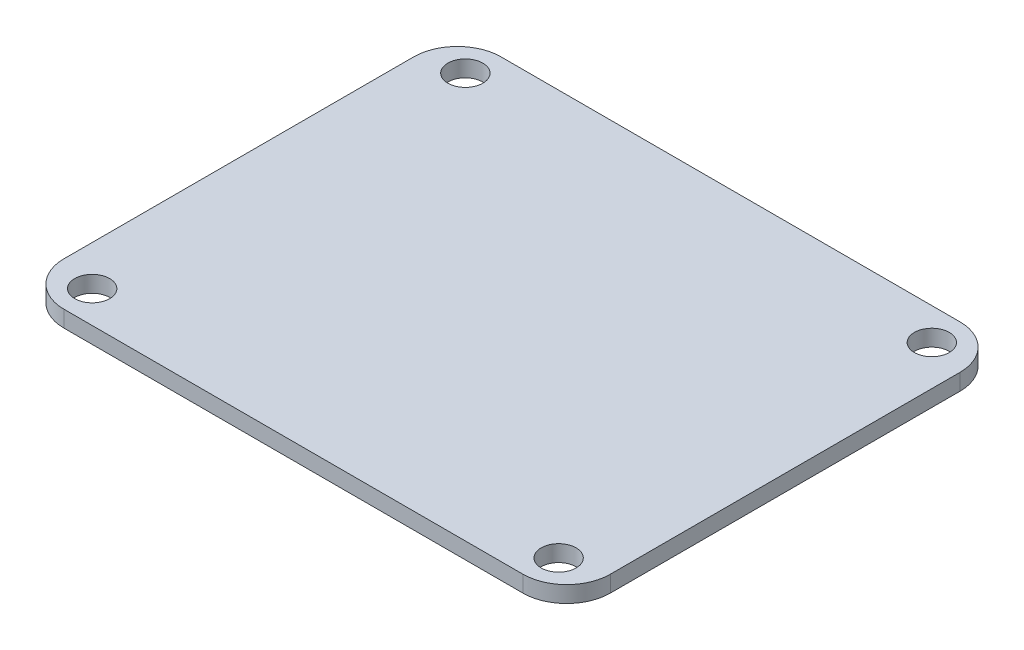
ISO-10303-21;
HEADER;
FILE_DESCRIPTION(('STEP AP214'),'2;1');
FILE_NAME('part.step','',(''),(''),'','','');
FILE_SCHEMA(('AUTOMOTIVE_DESIGN { 1 0 10303 214 1 1 1 1 }'));
ENDSEC;
DATA;
#1=APPLICATION_CONTEXT('core data for automotive mechanical design processes');
#2=APPLICATION_PROTOCOL_DEFINITION('international standard','automotive_design',2000,#1);
#3=PRODUCT_CONTEXT('',#1,'mechanical');
#4=PRODUCT('Part','Part','',(#3));
#5=PRODUCT_RELATED_PRODUCT_CATEGORY('part','',(#4));
#6=PRODUCT_DEFINITION_FORMATION('','',#4);
#7=PRODUCT_DEFINITION_CONTEXT('part definition',#1,'design');
#8=PRODUCT_DEFINITION('design','',#6,#7);
#9=PRODUCT_DEFINITION_SHAPE('','',#8);
#10=(LENGTH_UNIT() NAMED_UNIT(*) SI_UNIT(.MILLI.,.METRE.));
#11=(NAMED_UNIT(*) PLANE_ANGLE_UNIT() SI_UNIT($,.RADIAN.));
#12=(NAMED_UNIT(*) SI_UNIT($,.STERADIAN.) SOLID_ANGLE_UNIT());
#13=UNCERTAINTY_MEASURE_WITH_UNIT(LENGTH_MEASURE(1.E-05),#10,'distance_accuracy_value','');
#14=(GEOMETRIC_REPRESENTATION_CONTEXT(3) GLOBAL_UNCERTAINTY_ASSIGNED_CONTEXT((#13)) GLOBAL_UNIT_ASSIGNED_CONTEXT((#10,
#11,#12)) REPRESENTATION_CONTEXT('',''));
#15=CARTESIAN_POINT('',(0.,0.,0.));
#16=DIRECTION('',(0.,0.,1.));
#17=DIRECTION('',(1.,0.,0.));
#18=AXIS2_PLACEMENT_3D('',#15,#16,#17);
#19=CARTESIAN_POINT('',(-16.,1.5,16.));
#20=DIRECTION('',(0.,1.,0.));
#21=DIRECTION('',(0.,0.,1.));
#22=AXIS2_PLACEMENT_3D('',#19,#20,#21);
#23=PLANE('',#22);
#24=CARTESIAN_POINT('',(26.3437965591447,1.5,-17.0750372473158));
#25=DIRECTION('',(0.,1.,0.));
#26=DIRECTION('',(0.,0.,-1.));
#27=AXIS2_PLACEMENT_3D('',#24,#25,#26);
#28=CIRCLE('',#27,1.59760699781686);
#29=CARTESIAN_POINT('',(26.3437965591447,1.5,-18.6726442451327));
#30=VERTEX_POINT('',#29);
#31=EDGE_CURVE('E190',#30,#30,#28,.T.);
#32=ORIENTED_EDGE('',*,*,#31,.F.);
#33=EDGE_LOOP('',(#32));
#34=FACE_BOUND('',#33,.T.);
#35=CARTESIAN_POINT('',(-16.3437965591447,1.5,-17.0750372473158));
#36=DIRECTION('',(0.,1.,0.));
#37=DIRECTION('',(0.,0.,1.));
#38=AXIS2_PLACEMENT_3D('',#35,#36,#37);
#39=CIRCLE('',#38,1.59760699781686);
#40=CARTESIAN_POINT('',(-16.3437965591447,1.5,-15.4774302494989));
#41=VERTEX_POINT('',#40);
#42=EDGE_CURVE('E136',#41,#41,#39,.T.);
#43=ORIENTED_EDGE('',*,*,#42,.F.);
#44=EDGE_LOOP('',(#43));
#45=FACE_BOUND('',#44,.T.);
#46=CARTESIAN_POINT('',(-16.,1.5,16.));
#47=DIRECTION('',(0.,1.,0.));
#48=DIRECTION('',(0.,0.,1.));
#49=AXIS2_PLACEMENT_3D('',#46,#47,#48);
#50=CIRCLE('',#49,4.);
#51=CARTESIAN_POINT('',(-20.,1.5,16.));
#52=VERTEX_POINT('',#51);
#53=CARTESIAN_POINT('',(-16.,1.5,20.));
#54=VERTEX_POINT('',#53);
#55=EDGE_CURVE('E147',#52,#54,#50,.T.);
#56=ORIENTED_EDGE('',*,*,#55,.T.);
#57=DIRECTION('',(1.,0.,0.));
#58=VECTOR('',#57,1.);
#59=CARTESIAN_POINT('',(-16.,1.5,20.));
#60=LINE('',#59,#58);
#61=CARTESIAN_POINT('',(26.,1.5,20.));
#62=VERTEX_POINT('',#61);
#63=EDGE_CURVE('E95',#54,#62,#60,.T.);
#64=ORIENTED_EDGE('',*,*,#63,.T.);
#65=CARTESIAN_POINT('',(26.,1.5,16.));
#66=DIRECTION('',(0.,1.,0.));
#67=DIRECTION('',(0.,0.,1.));
#68=AXIS2_PLACEMENT_3D('',#65,#66,#67);
#69=CIRCLE('',#68,4.);
#70=CARTESIAN_POINT('',(30.,1.5,16.));
#71=VERTEX_POINT('',#70);
#72=EDGE_CURVE('E162',#62,#71,#69,.T.);
#73=ORIENTED_EDGE('',*,*,#72,.T.);
#74=DIRECTION('',(0.,0.,-1.));
#75=VECTOR('',#74,1.);
#76=CARTESIAN_POINT('',(30.,1.5,16.));
#77=LINE('',#76,#75);
#78=CARTESIAN_POINT('',(30.,1.5,-16.));
#79=VERTEX_POINT('',#78);
#80=EDGE_CURVE('E175',#71,#79,#77,.T.);
#81=ORIENTED_EDGE('',*,*,#80,.T.);
#82=CARTESIAN_POINT('',(26.,1.5,-16.));
#83=DIRECTION('',(0.,1.,0.));
#84=DIRECTION('',(0.,0.,1.));
#85=AXIS2_PLACEMENT_3D('',#82,#83,#84);
#86=CIRCLE('',#85,4.);
#87=CARTESIAN_POINT('',(26.,1.5,-20.));
#88=VERTEX_POINT('',#87);
#89=EDGE_CURVE('E114',#79,#88,#86,.T.);
#90=ORIENTED_EDGE('',*,*,#89,.T.);
#91=DIRECTION('',(-1.,0.,0.));
#92=VECTOR('',#91,1.);
#93=CARTESIAN_POINT('',(-16.,1.5,-20.));
#94=LINE('',#93,#92);
#95=CARTESIAN_POINT('',(-16.,1.5,-20.));
#96=VERTEX_POINT('',#95);
#97=EDGE_CURVE('E108',#88,#96,#94,.T.);
#98=ORIENTED_EDGE('',*,*,#97,.T.);
#99=CARTESIAN_POINT('',(-16.,1.5,-16.));
#100=DIRECTION('',(0.,1.,0.));
#101=DIRECTION('',(0.,0.,1.));
#102=AXIS2_PLACEMENT_3D('',#99,#100,#101);
#103=CIRCLE('',#102,4.);
#104=CARTESIAN_POINT('',(-20.,1.5,-16.));
#105=VERTEX_POINT('',#104);
#106=EDGE_CURVE('E112',#96,#105,#103,.T.);
#107=ORIENTED_EDGE('',*,*,#106,.T.);
#108=DIRECTION('',(0.,0.,1.));
#109=VECTOR('',#108,1.);
#110=CARTESIAN_POINT('',(-20.,1.5,16.));
#111=LINE('',#110,#109);
#112=EDGE_CURVE('E52',#105,#52,#111,.T.);
#113=ORIENTED_EDGE('',*,*,#112,.T.);
#114=EDGE_LOOP('',(#56,#64,#73,#81,#90,#98,#107,#113));
#115=FACE_BOUND('',#114,.T.);
#116=CARTESIAN_POINT('',(26.3437965591447,1.5,17.0750372473158));
#117=DIRECTION('',(0.,1.,0.));
#118=DIRECTION('',(0.,0.,1.));
#119=AXIS2_PLACEMENT_3D('',#116,#117,#118);
#120=CIRCLE('',#119,1.59760699781686);
#121=CARTESIAN_POINT('',(26.3437965591447,1.5,18.6726442451326));
#122=VERTEX_POINT('',#121);
#123=EDGE_CURVE('E184',#122,#122,#120,.T.);
#124=ORIENTED_EDGE('',*,*,#123,.F.);
#125=EDGE_LOOP('',(#124));
#126=FACE_BOUND('',#125,.T.);
#127=CARTESIAN_POINT('',(-16.3437965591447,1.5,17.0750372473158));
#128=DIRECTION('',(0.,1.,0.));
#129=DIRECTION('',(0.,0.,-1.));
#130=AXIS2_PLACEMENT_3D('',#127,#128,#129);
#131=CIRCLE('',#130,1.59760699781686);
#132=CARTESIAN_POINT('',(-16.3437965591447,1.5,15.4774302494989));
#133=VERTEX_POINT('',#132);
#134=EDGE_CURVE('E196',#133,#133,#131,.T.);
#135=ORIENTED_EDGE('',*,*,#134,.F.);
#136=EDGE_LOOP('',(#135));
#137=FACE_BOUND('',#136,.T.);
#138=ADVANCED_FACE('F35',(#34,#45,#115,#126,#137),#23,.T.);
#139=CARTESIAN_POINT('',(-16.,0.,16.));
#140=DIRECTION('',(0.,1.,0.));
#141=DIRECTION('',(0.,0.,1.));
#142=AXIS2_PLACEMENT_3D('',#139,#140,#141);
#143=PLANE('',#142);
#144=CARTESIAN_POINT('',(26.3437965591447,0.,-17.0750372473158));
#145=DIRECTION('',(0.,1.,0.));
#146=DIRECTION('',(0.,0.,-1.));
#147=AXIS2_PLACEMENT_3D('',#144,#145,#146);
#148=CIRCLE('',#147,1.59760699781686);
#149=CARTESIAN_POINT('',(26.3437965591447,0.,-18.6726442451327));
#150=VERTEX_POINT('',#149);
#151=EDGE_CURVE('E193',#150,#150,#148,.T.);
#152=ORIENTED_EDGE('',*,*,#151,.T.);
#153=EDGE_LOOP('',(#152));
#154=FACE_BOUND('',#153,.T.);
#155=CARTESIAN_POINT('',(-16.3437965591447,0.,-17.0750372473158));
#156=DIRECTION('',(0.,1.,0.));
#157=DIRECTION('',(0.,0.,1.));
#158=AXIS2_PLACEMENT_3D('',#155,#156,#157);
#159=CIRCLE('',#158,1.59760699781686);
#160=CARTESIAN_POINT('',(-16.3437965591447,0.,-15.4774302494989));
#161=VERTEX_POINT('',#160);
#162=EDGE_CURVE('E181',#161,#161,#159,.T.);
#163=ORIENTED_EDGE('',*,*,#162,.T.);
#164=EDGE_LOOP('',(#163));
#165=FACE_BOUND('',#164,.T.);
#166=CARTESIAN_POINT('',(-16.,0.,16.));
#167=DIRECTION('',(0.,1.,0.));
#168=DIRECTION('',(0.,0.,1.));
#169=AXIS2_PLACEMENT_3D('',#166,#167,#168);
#170=CIRCLE('',#169,4.);
#171=CARTESIAN_POINT('',(-20.,0.,16.));
#172=VERTEX_POINT('',#171);
#173=CARTESIAN_POINT('',(-16.,0.,20.));
#174=VERTEX_POINT('',#173);
#175=EDGE_CURVE('E132',#172,#174,#170,.T.);
#176=ORIENTED_EDGE('',*,*,#175,.F.);
#177=DIRECTION('',(0.,0.,1.));
#178=VECTOR('',#177,1.);
#179=CARTESIAN_POINT('',(-20.,0.,16.));
#180=LINE('',#179,#178);
#181=CARTESIAN_POINT('',(-20.,0.,-16.));
#182=VERTEX_POINT('',#181);
#183=EDGE_CURVE('E87',#182,#172,#180,.T.);
#184=ORIENTED_EDGE('',*,*,#183,.F.);
#185=CARTESIAN_POINT('',(-16.,0.,-16.));
#186=DIRECTION('',(0.,1.,0.));
#187=DIRECTION('',(0.,0.,1.));
#188=AXIS2_PLACEMENT_3D('',#185,#186,#187);
#189=CIRCLE('',#188,4.);
#190=CARTESIAN_POINT('',(-16.,0.,-20.));
#191=VERTEX_POINT('',#190);
#192=EDGE_CURVE('E81',#191,#182,#189,.T.);
#193=ORIENTED_EDGE('',*,*,#192,.F.);
#194=DIRECTION('',(-1.,0.,0.));
#195=VECTOR('',#194,1.);
#196=CARTESIAN_POINT('',(-16.,0.,-20.));
#197=LINE('',#196,#195);
#198=CARTESIAN_POINT('',(26.,0.,-20.));
#199=VERTEX_POINT('',#198);
#200=EDGE_CURVE('E122',#199,#191,#197,.T.);
#201=ORIENTED_EDGE('',*,*,#200,.F.);
#202=CARTESIAN_POINT('',(26.,0.,-16.));
#203=DIRECTION('',(0.,1.,0.));
#204=DIRECTION('',(0.,0.,1.));
#205=AXIS2_PLACEMENT_3D('',#202,#203,#204);
#206=CIRCLE('',#205,4.);
#207=CARTESIAN_POINT('',(30.,0.,-16.));
#208=VERTEX_POINT('',#207);
#209=EDGE_CURVE('E142',#208,#199,#206,.T.);
#210=ORIENTED_EDGE('',*,*,#209,.F.);
#211=DIRECTION('',(0.,0.,-1.));
#212=VECTOR('',#211,1.);
#213=CARTESIAN_POINT('',(30.,0.,16.));
#214=LINE('',#213,#212);
#215=CARTESIAN_POINT('',(30.,0.,16.));
#216=VERTEX_POINT('',#215);
#217=EDGE_CURVE('E140',#216,#208,#214,.T.);
#218=ORIENTED_EDGE('',*,*,#217,.F.);
#219=CARTESIAN_POINT('',(26.,0.,16.));
#220=DIRECTION('',(0.,1.,0.));
#221=DIRECTION('',(0.,0.,1.));
#222=AXIS2_PLACEMENT_3D('',#219,#220,#221);
#223=CIRCLE('',#222,4.);
#224=CARTESIAN_POINT('',(26.,0.,20.));
#225=VERTEX_POINT('',#224);
#226=EDGE_CURVE('E138',#225,#216,#223,.T.);
#227=ORIENTED_EDGE('',*,*,#226,.F.);
#228=DIRECTION('',(1.,0.,0.));
#229=VECTOR('',#228,1.);
#230=CARTESIAN_POINT('',(-16.,0.,20.));
#231=LINE('',#230,#229);
#232=EDGE_CURVE('E135',#174,#225,#231,.T.);
#233=ORIENTED_EDGE('',*,*,#232,.F.);
#234=EDGE_LOOP('',(#176,#184,#193,#201,#210,#218,#227,#233));
#235=FACE_BOUND('',#234,.T.);
#236=CARTESIAN_POINT('',(26.3437965591447,0.,17.0750372473158));
#237=DIRECTION('',(0.,1.,0.));
#238=DIRECTION('',(0.,0.,1.));
#239=AXIS2_PLACEMENT_3D('',#236,#237,#238);
#240=CIRCLE('',#239,1.59760699781686);
#241=CARTESIAN_POINT('',(26.3437965591447,0.,18.6726442451326));
#242=VERTEX_POINT('',#241);
#243=EDGE_CURVE('E187',#242,#242,#240,.T.);
#244=ORIENTED_EDGE('',*,*,#243,.T.);
#245=EDGE_LOOP('',(#244));
#246=FACE_BOUND('',#245,.T.);
#247=CARTESIAN_POINT('',(-16.3437965591447,0.,17.0750372473158));
#248=DIRECTION('',(0.,1.,0.));
#249=DIRECTION('',(0.,0.,-1.));
#250=AXIS2_PLACEMENT_3D('',#247,#248,#249);
#251=CIRCLE('',#250,1.59760699781686);
#252=CARTESIAN_POINT('',(-16.3437965591447,0.,15.4774302494989));
#253=VERTEX_POINT('',#252);
#254=EDGE_CURVE('E199',#253,#253,#251,.T.);
#255=ORIENTED_EDGE('',*,*,#254,.T.);
#256=EDGE_LOOP('',(#255));
#257=FACE_BOUND('',#256,.T.);
#258=ADVANCED_FACE('F166',(#154,#165,#235,#246,#257),#143,.F.);
#259=CARTESIAN_POINT('',(-16.,1.5,16.));
#260=DIRECTION('',(0.,-1.,0.));
#261=DIRECTION('',(0.,0.,-1.));
#262=AXIS2_PLACEMENT_3D('',#259,#260,#261);
#263=CYLINDRICAL_SURFACE('',#262,4.);
#264=ORIENTED_EDGE('',*,*,#175,.T.);
#265=DIRECTION('',(0.,-1.,0.));
#266=VECTOR('',#265,1.);
#267=CARTESIAN_POINT('',(-16.,1.5,20.));
#268=LINE('',#267,#266);
#269=EDGE_CURVE('E11',#54,#174,#268,.T.);
#270=ORIENTED_EDGE('',*,*,#269,.F.);
#271=ORIENTED_EDGE('',*,*,#55,.F.);
#272=DIRECTION('',(0.,-1.,0.));
#273=VECTOR('',#272,1.);
#274=CARTESIAN_POINT('',(-20.,1.5,16.));
#275=LINE('',#274,#273);
#276=EDGE_CURVE('E128',#52,#172,#275,.T.);
#277=ORIENTED_EDGE('',*,*,#276,.T.);
#278=EDGE_LOOP('',(#264,#270,#271,#277));
#279=FACE_BOUND('',#278,.T.);
#280=ADVANCED_FACE('F37',(#279),#263,.T.);
#281=CARTESIAN_POINT('',(-16.,1.5,20.));
#282=DIRECTION('',(0.,0.,-1.));
#283=DIRECTION('',(-1.,0.,0.));
#284=AXIS2_PLACEMENT_3D('',#281,#282,#283);
#285=PLANE('',#284);
#286=ORIENTED_EDGE('',*,*,#232,.T.);
#287=DIRECTION('',(0.,-1.,0.));
#288=VECTOR('',#287,1.);
#289=CARTESIAN_POINT('',(26.,1.5,20.));
#290=LINE('',#289,#288);
#291=EDGE_CURVE('E44',#62,#225,#290,.T.);
#292=ORIENTED_EDGE('',*,*,#291,.F.);
#293=ORIENTED_EDGE('',*,*,#63,.F.);
#294=ORIENTED_EDGE('',*,*,#269,.T.);
#295=EDGE_LOOP('',(#286,#292,#293,#294));
#296=FACE_BOUND('',#295,.T.);
#297=ADVANCED_FACE('F234',(#296),#285,.F.);
#298=CARTESIAN_POINT('',(26.,1.5,16.));
#299=DIRECTION('',(0.,-1.,0.));
#300=DIRECTION('',(0.,0.,-1.));
#301=AXIS2_PLACEMENT_3D('',#298,#299,#300);
#302=CYLINDRICAL_SURFACE('',#301,4.);
#303=ORIENTED_EDGE('',*,*,#226,.T.);
#304=DIRECTION('',(0.,-1.,0.));
#305=VECTOR('',#304,1.);
#306=CARTESIAN_POINT('',(30.,1.5,16.));
#307=LINE('',#306,#305);
#308=EDGE_CURVE('E154',#71,#216,#307,.T.);
#309=ORIENTED_EDGE('',*,*,#308,.F.);
#310=ORIENTED_EDGE('',*,*,#72,.F.);
#311=ORIENTED_EDGE('',*,*,#291,.T.);
#312=EDGE_LOOP('',(#303,#309,#310,#311));
#313=FACE_BOUND('',#312,.T.);
#314=ADVANCED_FACE('F160',(#313),#302,.T.);
#315=CARTESIAN_POINT('',(30.,1.5,16.));
#316=DIRECTION('',(-1.,0.,0.));
#317=DIRECTION('',(0.,0.,1.));
#318=AXIS2_PLACEMENT_3D('',#315,#316,#317);
#319=PLANE('',#318);
#320=ORIENTED_EDGE('',*,*,#217,.T.);
#321=DIRECTION('',(0.,-1.,0.));
#322=VECTOR('',#321,1.);
#323=CARTESIAN_POINT('',(30.,1.5,-16.));
#324=LINE('',#323,#322);
#325=EDGE_CURVE('E151',#79,#208,#324,.T.);
#326=ORIENTED_EDGE('',*,*,#325,.F.);
#327=ORIENTED_EDGE('',*,*,#80,.F.);
#328=ORIENTED_EDGE('',*,*,#308,.T.);
#329=EDGE_LOOP('',(#320,#326,#327,#328));
#330=FACE_BOUND('',#329,.T.);
#331=ADVANCED_FACE('F171',(#330),#319,.F.);
#332=CARTESIAN_POINT('',(26.,1.5,-16.));
#333=DIRECTION('',(0.,-1.,0.));
#334=DIRECTION('',(0.,0.,-1.));
#335=AXIS2_PLACEMENT_3D('',#332,#333,#334);
#336=CYLINDRICAL_SURFACE('',#335,4.);
#337=ORIENTED_EDGE('',*,*,#209,.T.);
#338=DIRECTION('',(0.,-1.,0.));
#339=VECTOR('',#338,1.);
#340=CARTESIAN_POINT('',(26.,1.5,-20.));
#341=LINE('',#340,#339);
#342=EDGE_CURVE('E123',#88,#199,#341,.T.);
#343=ORIENTED_EDGE('',*,*,#342,.F.);
#344=ORIENTED_EDGE('',*,*,#89,.F.);
#345=ORIENTED_EDGE('',*,*,#325,.T.);
#346=EDGE_LOOP('',(#337,#343,#344,#345));
#347=FACE_BOUND('',#346,.T.);
#348=ADVANCED_FACE('F174',(#347),#336,.T.);
#349=CARTESIAN_POINT('',(-16.,1.5,-20.));
#350=DIRECTION('',(0.,0.,1.));
#351=DIRECTION('',(1.,0.,0.));
#352=AXIS2_PLACEMENT_3D('',#349,#350,#351);
#353=PLANE('',#352);
#354=ORIENTED_EDGE('',*,*,#200,.T.);
#355=DIRECTION('',(0.,-1.,0.));
#356=VECTOR('',#355,1.);
#357=CARTESIAN_POINT('',(-16.,1.5,-20.));
#358=LINE('',#357,#356);
#359=EDGE_CURVE('E119',#96,#191,#358,.T.);
#360=ORIENTED_EDGE('',*,*,#359,.F.);
#361=ORIENTED_EDGE('',*,*,#97,.F.);
#362=ORIENTED_EDGE('',*,*,#342,.T.);
#363=EDGE_LOOP('',(#354,#360,#361,#362));
#364=FACE_BOUND('',#363,.T.);
#365=ADVANCED_FACE('F120',(#364),#353,.F.);
#366=CARTESIAN_POINT('',(-16.,1.5,-16.));
#367=DIRECTION('',(0.,-1.,0.));
#368=DIRECTION('',(0.,0.,-1.));
#369=AXIS2_PLACEMENT_3D('',#366,#367,#368);
#370=CYLINDRICAL_SURFACE('',#369,4.);
#371=ORIENTED_EDGE('',*,*,#192,.T.);
#372=DIRECTION('',(0.,-1.,0.));
#373=VECTOR('',#372,1.);
#374=CARTESIAN_POINT('',(-20.,1.5,-16.));
#375=LINE('',#374,#373);
#376=EDGE_CURVE('E124',#105,#182,#375,.T.);
#377=ORIENTED_EDGE('',*,*,#376,.F.);
#378=ORIENTED_EDGE('',*,*,#106,.F.);
#379=ORIENTED_EDGE('',*,*,#359,.T.);
#380=EDGE_LOOP('',(#371,#377,#378,#379));
#381=FACE_BOUND('',#380,.T.);
#382=ADVANCED_FACE('F126',(#381),#370,.T.);
#383=CARTESIAN_POINT('',(-20.,1.5,16.));
#384=DIRECTION('',(1.,0.,0.));
#385=DIRECTION('',(0.,0.,-1.));
#386=AXIS2_PLACEMENT_3D('',#383,#384,#385);
#387=PLANE('',#386);
#388=ORIENTED_EDGE('',*,*,#183,.T.);
#389=ORIENTED_EDGE('',*,*,#276,.F.);
#390=ORIENTED_EDGE('',*,*,#112,.F.);
#391=ORIENTED_EDGE('',*,*,#376,.T.);
#392=EDGE_LOOP('',(#388,#389,#390,#391));
#393=FACE_BOUND('',#392,.T.);
#394=ADVANCED_FACE('F222',(#393),#387,.F.);
#395=CARTESIAN_POINT('',(-16.3437965591447,1.5,-17.0750372473158));
#396=DIRECTION('',(0.,-1.,0.));
#397=DIRECTION('',(0.,0.,-1.));
#398=AXIS2_PLACEMENT_3D('',#395,#396,#397);
#399=CYLINDRICAL_SURFACE('',#398,1.59760699781686);
#400=ORIENTED_EDGE('',*,*,#42,.T.);
#401=EDGE_LOOP('',(#400));
#402=FACE_BOUND('',#401,.T.);
#403=ORIENTED_EDGE('',*,*,#162,.F.);
#404=EDGE_LOOP('',(#403));
#405=FACE_BOUND('',#404,.T.);
#406=ADVANCED_FACE('F219',(#402,#405),#399,.F.);
#407=CARTESIAN_POINT('',(26.3437965591447,1.5,17.0750372473158));
#408=DIRECTION('',(0.,-1.,0.));
#409=DIRECTION('',(0.,0.,-1.));
#410=AXIS2_PLACEMENT_3D('',#407,#408,#409);
#411=CYLINDRICAL_SURFACE('',#410,1.59760699781686);
#412=ORIENTED_EDGE('',*,*,#123,.T.);
#413=EDGE_LOOP('',(#412));
#414=FACE_BOUND('',#413,.T.);
#415=ORIENTED_EDGE('',*,*,#243,.F.);
#416=EDGE_LOOP('',(#415));
#417=FACE_BOUND('',#416,.T.);
#418=ADVANCED_FACE('F298',(#414,#417),#411,.F.);
#419=CARTESIAN_POINT('',(26.3437965591447,1.5,-17.0750372473158));
#420=DIRECTION('',(0.,-1.,0.));
#421=DIRECTION('',(0.,0.,-1.));
#422=AXIS2_PLACEMENT_3D('',#419,#420,#421);
#423=CYLINDRICAL_SURFACE('',#422,1.59760699781686);
#424=ORIENTED_EDGE('',*,*,#31,.T.);
#425=EDGE_LOOP('',(#424));
#426=FACE_BOUND('',#425,.T.);
#427=ORIENTED_EDGE('',*,*,#151,.F.);
#428=EDGE_LOOP('',(#427));
#429=FACE_BOUND('',#428,.T.);
#430=ADVANCED_FACE('F306',(#426,#429),#423,.F.);
#431=CARTESIAN_POINT('',(-16.3437965591447,1.5,17.0750372473158));
#432=DIRECTION('',(0.,-1.,0.));
#433=DIRECTION('',(0.,0.,-1.));
#434=AXIS2_PLACEMENT_3D('',#431,#432,#433);
#435=CYLINDRICAL_SURFACE('',#434,1.59760699781686);
#436=ORIENTED_EDGE('',*,*,#134,.T.);
#437=EDGE_LOOP('',(#436));
#438=FACE_BOUND('',#437,.T.);
#439=ORIENTED_EDGE('',*,*,#254,.F.);
#440=EDGE_LOOP('',(#439));
#441=FACE_BOUND('',#440,.T.);
#442=ADVANCED_FACE('F205',(#438,#441),#435,.F.);
#443=CLOSED_SHELL('',(#138,#258,#280,#297,#314,#331,#348,#365,#382,#394,#406,#418,#430,#442));
#444=MANIFOLD_SOLID_BREP('B2',#443);
#445=ADVANCED_BREP_SHAPE_REPRESENTATION('',(#18,#444),#14);
#446=SHAPE_DEFINITION_REPRESENTATION(#9,#445);
ENDSEC;
END-ISO-10303-21;
